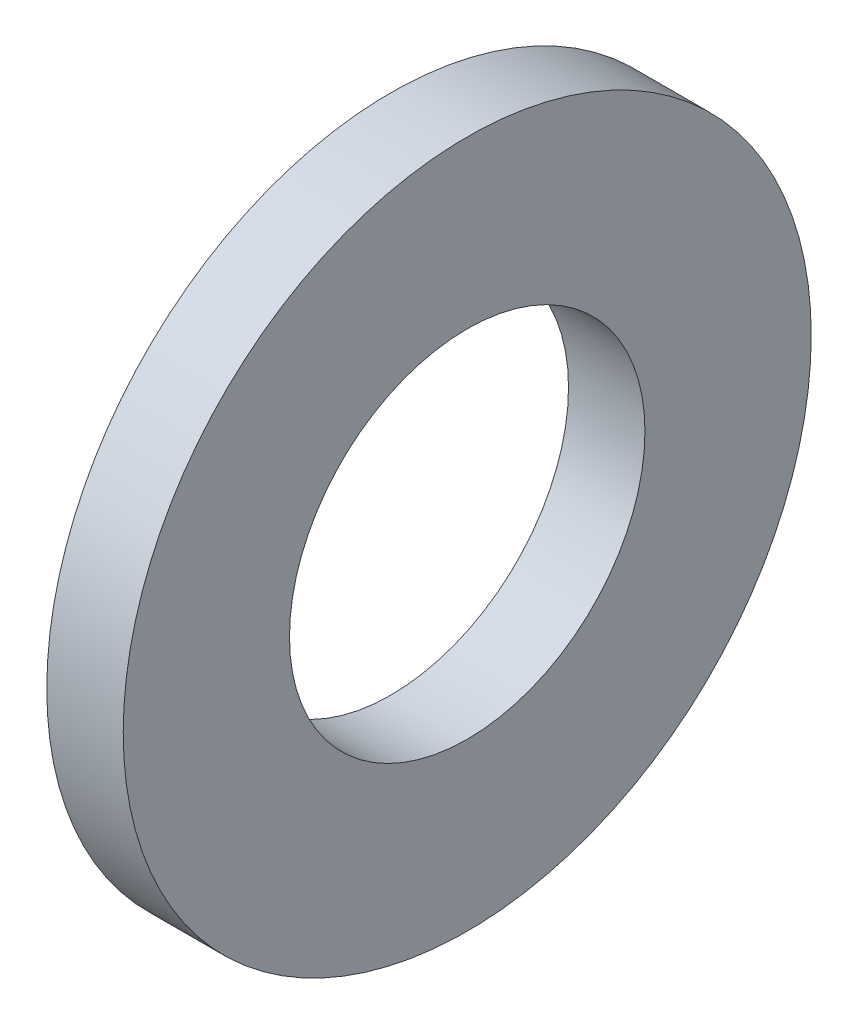
ISO-10303-21;
HEADER;
FILE_DESCRIPTION(('STEP AP214'),'2;1');
FILE_NAME('part.step','',(''),(''),'','','');
FILE_SCHEMA(('AUTOMOTIVE_DESIGN { 1 0 10303 214 1 1 1 1 }'));
ENDSEC;
DATA;
#1=APPLICATION_CONTEXT('core data for automotive mechanical design processes');
#2=APPLICATION_PROTOCOL_DEFINITION('international standard','automotive_design',2000,#1);
#3=PRODUCT_CONTEXT('',#1,'mechanical');
#4=PRODUCT('Part','Part','',(#3));
#5=PRODUCT_RELATED_PRODUCT_CATEGORY('part','',(#4));
#6=PRODUCT_DEFINITION_FORMATION('','',#4);
#7=PRODUCT_DEFINITION_CONTEXT('part definition',#1,'design');
#8=PRODUCT_DEFINITION('design','',#6,#7);
#9=PRODUCT_DEFINITION_SHAPE('','',#8);
#10=(LENGTH_UNIT() NAMED_UNIT(*) SI_UNIT(.MILLI.,.METRE.));
#11=(NAMED_UNIT(*) PLANE_ANGLE_UNIT() SI_UNIT($,.RADIAN.));
#12=(NAMED_UNIT(*) SI_UNIT($,.STERADIAN.) SOLID_ANGLE_UNIT());
#13=UNCERTAINTY_MEASURE_WITH_UNIT(LENGTH_MEASURE(1.E-05),#10,'distance_accuracy_value','');
#14=(GEOMETRIC_REPRESENTATION_CONTEXT(3) GLOBAL_UNCERTAINTY_ASSIGNED_CONTEXT((#13)) GLOBAL_UNIT_ASSIGNED_CONTEXT((#10,
#11,#12)) REPRESENTATION_CONTEXT('',''));
#15=CARTESIAN_POINT('',(0.,0.,0.));
#16=DIRECTION('',(0.,0.,1.));
#17=DIRECTION('',(1.,0.,0.));
#18=AXIS2_PLACEMENT_3D('',#15,#16,#17);
#19=CARTESIAN_POINT('',(2.,0.,0.));
#20=DIRECTION('',(1.,0.,0.));
#21=DIRECTION('',(0.,0.,-1.));
#22=AXIS2_PLACEMENT_3D('',#19,#20,#21);
#23=PLANE('',#22);
#24=CARTESIAN_POINT('',(2.,0.,0.));
#25=DIRECTION('',(1.,0.,0.));
#26=DIRECTION('',(0.,0.,-1.));
#27=AXIS2_PLACEMENT_3D('',#24,#25,#26);
#28=CIRCLE('',#27,9.);
#29=CARTESIAN_POINT('',(2.,0.,-9.));
#30=VERTEX_POINT('',#29);
#31=EDGE_CURVE('E10',#30,#30,#28,.T.);
#32=ORIENTED_EDGE('',*,*,#31,.T.);
#33=EDGE_LOOP('',(#32));
#34=FACE_BOUND('',#33,.T.);
#35=CARTESIAN_POINT('',(2.,0.,0.));
#36=DIRECTION('',(1.,0.,0.));
#37=DIRECTION('',(0.,0.,-1.));
#38=AXIS2_PLACEMENT_3D('',#35,#36,#37);
#39=CIRCLE('',#38,4.65);
#40=CARTESIAN_POINT('',(2.,0.,-4.65));
#41=VERTEX_POINT('',#40);
#42=EDGE_CURVE('E43',#41,#41,#39,.T.);
#43=ORIENTED_EDGE('',*,*,#42,.F.);
#44=EDGE_LOOP('',(#43));
#45=FACE_BOUND('',#44,.T.);
#46=ADVANCED_FACE('F32',(#34,#45),#23,.T.);
#47=CARTESIAN_POINT('',(0.,0.,0.));
#48=DIRECTION('',(1.,0.,0.));
#49=DIRECTION('',(0.,0.,-1.));
#50=AXIS2_PLACEMENT_3D('',#47,#48,#49);
#51=PLANE('',#50);
#52=CARTESIAN_POINT('',(0.,0.,0.));
#53=DIRECTION('',(1.,0.,0.));
#54=DIRECTION('',(0.,0.,-1.));
#55=AXIS2_PLACEMENT_3D('',#52,#53,#54);
#56=CIRCLE('',#55,9.);
#57=CARTESIAN_POINT('',(0.,0.,-9.));
#58=VERTEX_POINT('',#57);
#59=EDGE_CURVE('E36',#58,#58,#56,.T.);
#60=ORIENTED_EDGE('',*,*,#59,.F.);
#61=EDGE_LOOP('',(#60));
#62=FACE_BOUND('',#61,.T.);
#63=CARTESIAN_POINT('',(0.,0.,0.));
#64=DIRECTION('',(1.,0.,0.));
#65=DIRECTION('',(0.,0.,-1.));
#66=AXIS2_PLACEMENT_3D('',#63,#64,#65);
#67=CIRCLE('',#66,4.65);
#68=CARTESIAN_POINT('',(0.,0.,-4.65));
#69=VERTEX_POINT('',#68);
#70=EDGE_CURVE('E45',#69,#69,#67,.T.);
#71=ORIENTED_EDGE('',*,*,#70,.T.);
#72=EDGE_LOOP('',(#71));
#73=FACE_BOUND('',#72,.T.);
#74=ADVANCED_FACE('F55',(#62,#73),#51,.F.);
#75=CARTESIAN_POINT('',(2.,0.,0.));
#76=DIRECTION('',(-1.,0.,0.));
#77=DIRECTION('',(0.,0.,1.));
#78=AXIS2_PLACEMENT_3D('',#75,#76,#77);
#79=CYLINDRICAL_SURFACE('',#78,9.);
#80=ORIENTED_EDGE('',*,*,#31,.F.);
#81=EDGE_LOOP('',(#80));
#82=FACE_BOUND('',#81,.T.);
#83=ORIENTED_EDGE('',*,*,#59,.T.);
#84=EDGE_LOOP('',(#83));
#85=FACE_BOUND('',#84,.T.);
#86=ADVANCED_FACE('F34',(#82,#85),#79,.T.);
#87=CARTESIAN_POINT('',(2.,0.,0.));
#88=DIRECTION('',(-1.,0.,0.));
#89=DIRECTION('',(0.,0.,1.));
#90=AXIS2_PLACEMENT_3D('',#87,#88,#89);
#91=CYLINDRICAL_SURFACE('',#90,4.65);
#92=ORIENTED_EDGE('',*,*,#42,.T.);
#93=EDGE_LOOP('',(#92));
#94=FACE_BOUND('',#93,.T.);
#95=ORIENTED_EDGE('',*,*,#70,.F.);
#96=EDGE_LOOP('',(#95));
#97=FACE_BOUND('',#96,.T.);
#98=ADVANCED_FACE('F51',(#94,#97),#91,.F.);
#99=CLOSED_SHELL('',(#46,#74,#86,#98));
#100=MANIFOLD_SOLID_BREP('B2',#99);
#101=ADVANCED_BREP_SHAPE_REPRESENTATION('',(#18,#100),#14);
#102=SHAPE_DEFINITION_REPRESENTATION(#9,#101);
ENDSEC;
END-ISO-10303-21;
